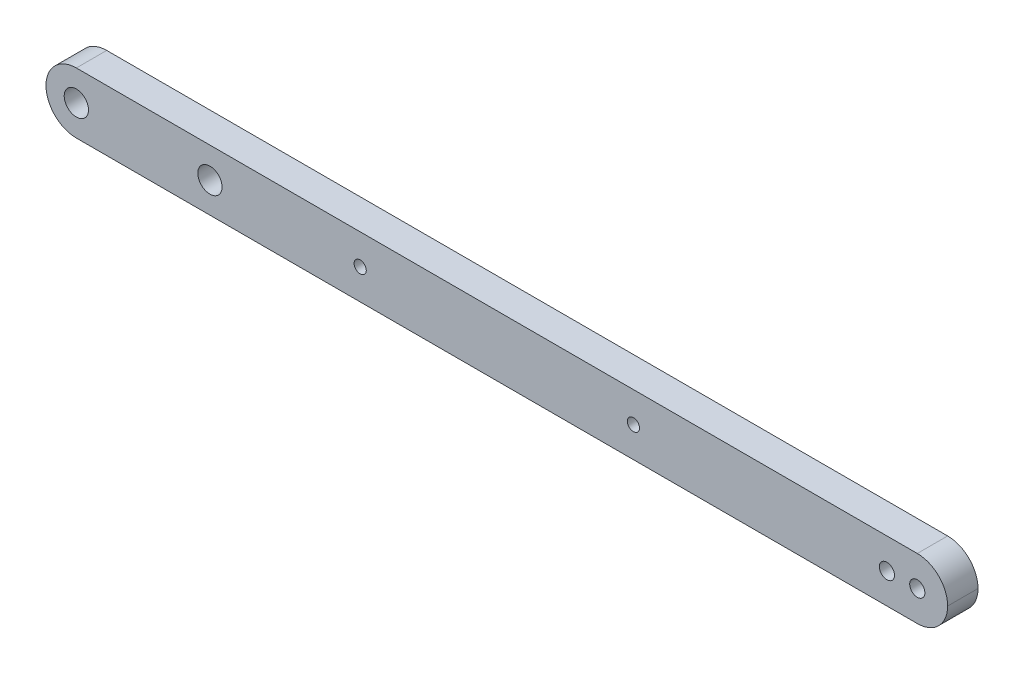
ISO-10303-21;
HEADER;
FILE_DESCRIPTION(('STEP AP214'),'2;1');
FILE_NAME('part.step','',(''),(''),'','','');
FILE_SCHEMA(('AUTOMOTIVE_DESIGN { 1 0 10303 214 1 1 1 1 }'));
ENDSEC;
DATA;
#1=APPLICATION_CONTEXT('core data for automotive mechanical design processes');
#2=APPLICATION_PROTOCOL_DEFINITION('international standard','automotive_design',2000,#1);
#3=PRODUCT_CONTEXT('',#1,'mechanical');
#4=PRODUCT('Part','Part','',(#3));
#5=PRODUCT_RELATED_PRODUCT_CATEGORY('part','',(#4));
#6=PRODUCT_DEFINITION_FORMATION('','',#4);
#7=PRODUCT_DEFINITION_CONTEXT('part definition',#1,'design');
#8=PRODUCT_DEFINITION('design','',#6,#7);
#9=PRODUCT_DEFINITION_SHAPE('','',#8);
#10=(LENGTH_UNIT() NAMED_UNIT(*) SI_UNIT(.MILLI.,.METRE.));
#11=(NAMED_UNIT(*) PLANE_ANGLE_UNIT() SI_UNIT($,.RADIAN.));
#12=(NAMED_UNIT(*) SI_UNIT($,.STERADIAN.) SOLID_ANGLE_UNIT());
#13=UNCERTAINTY_MEASURE_WITH_UNIT(LENGTH_MEASURE(1.E-05),#10,'distance_accuracy_value','');
#14=(GEOMETRIC_REPRESENTATION_CONTEXT(3) GLOBAL_UNCERTAINTY_ASSIGNED_CONTEXT((#13)) GLOBAL_UNIT_ASSIGNED_CONTEXT((#10,
#11,#12)) REPRESENTATION_CONTEXT('',''));
#15=CARTESIAN_POINT('',(0.,0.,0.));
#16=DIRECTION('',(0.,0.,1.));
#17=DIRECTION('',(1.,0.,0.));
#18=AXIS2_PLACEMENT_3D('',#15,#16,#17);
#19=CARTESIAN_POINT('',(0.,0.,10.));
#20=DIRECTION('',(0.,0.,1.));
#21=DIRECTION('',(1.,0.,0.));
#22=AXIS2_PLACEMENT_3D('',#19,#20,#21);
#23=PLANE('',#22);
#24=CARTESIAN_POINT('',(103.5,10.,10.));
#25=DIRECTION('',(0.,0.,1.));
#26=DIRECTION('',(1.,0.,0.));
#27=AXIS2_PLACEMENT_3D('',#24,#25,#26);
#28=CIRCLE('',#27,2.);
#29=CARTESIAN_POINT('',(105.5,10.,10.));
#30=VERTEX_POINT('',#29);
#31=EDGE_CURVE('E177',#30,#30,#28,.T.);
#32=ORIENTED_EDGE('',*,*,#31,.F.);
#33=EDGE_LOOP('',(#32));
#34=FACE_BOUND('',#33,.T.);
#35=CARTESIAN_POINT('',(277.,10.,10.));
#36=DIRECTION('',(0.,0.,1.));
#37=DIRECTION('',(1.,0.,0.));
#38=AXIS2_PLACEMENT_3D('',#35,#36,#37);
#39=CIRCLE('',#38,2.50000000000002);
#40=CARTESIAN_POINT('',(279.5,10.,10.));
#41=VERTEX_POINT('',#40);
#42=EDGE_CURVE('E165',#41,#41,#39,.T.);
#43=ORIENTED_EDGE('',*,*,#42,.F.);
#44=EDGE_LOOP('',(#43));
#45=FACE_BOUND('',#44,.T.);
#46=CARTESIAN_POINT('',(54.,10.,10.));
#47=DIRECTION('',(0.,0.,1.));
#48=DIRECTION('',(1.,0.,0.));
#49=AXIS2_PLACEMENT_3D('',#46,#47,#48);
#50=CIRCLE('',#49,4.00000000000001);
#51=CARTESIAN_POINT('',(58.,10.,10.));
#52=VERTEX_POINT('',#51);
#53=EDGE_CURVE('E120',#52,#52,#50,.T.);
#54=ORIENTED_EDGE('',*,*,#53,.F.);
#55=EDGE_LOOP('',(#54));
#56=FACE_BOUND('',#55,.T.);
#57=CARTESIAN_POINT('',(10.,10.,10.));
#58=DIRECTION('',(0.,0.,1.));
#59=DIRECTION('',(1.,0.,0.));
#60=AXIS2_PLACEMENT_3D('',#57,#58,#59);
#61=CIRCLE('',#60,10.);
#62=CARTESIAN_POINT('',(10.,20.,10.));
#63=VERTEX_POINT('',#62);
#64=CARTESIAN_POINT('',(0.,10.,10.));
#65=VERTEX_POINT('',#64);
#66=EDGE_CURVE('E137',#63,#65,#61,.T.);
#67=ORIENTED_EDGE('',*,*,#66,.T.);
#68=CARTESIAN_POINT('',(10.,10.,10.));
#69=DIRECTION('',(0.,0.,1.));
#70=DIRECTION('',(1.,0.,0.));
#71=AXIS2_PLACEMENT_3D('',#68,#69,#70);
#72=CIRCLE('',#71,10.);
#73=CARTESIAN_POINT('',(10.,0.,10.));
#74=VERTEX_POINT('',#73);
#75=EDGE_CURVE('E139',#65,#74,#72,.T.);
#76=ORIENTED_EDGE('',*,*,#75,.T.);
#77=DIRECTION('',(1.,0.,0.));
#78=VECTOR('',#77,1.);
#79=CARTESIAN_POINT('',(0.,0.,10.));
#80=LINE('',#79,#78);
#81=CARTESIAN_POINT('',(287.,0.,10.));
#82=VERTEX_POINT('',#81);
#83=EDGE_CURVE('E111',#74,#82,#80,.T.);
#84=ORIENTED_EDGE('',*,*,#83,.T.);
#85=CARTESIAN_POINT('',(287.,10.,10.));
#86=DIRECTION('',(0.,0.,1.));
#87=DIRECTION('',(1.,0.,0.));
#88=AXIS2_PLACEMENT_3D('',#85,#86,#87);
#89=CIRCLE('',#88,10.);
#90=CARTESIAN_POINT('',(297.,10.,10.));
#91=VERTEX_POINT('',#90);
#92=EDGE_CURVE('E135',#82,#91,#89,.T.);
#93=ORIENTED_EDGE('',*,*,#92,.T.);
#94=CARTESIAN_POINT('',(287.,10.,10.));
#95=DIRECTION('',(0.,0.,1.));
#96=DIRECTION('',(1.,0.,0.));
#97=AXIS2_PLACEMENT_3D('',#94,#95,#96);
#98=CIRCLE('',#97,10.);
#99=CARTESIAN_POINT('',(287.,20.,10.));
#100=VERTEX_POINT('',#99);
#101=EDGE_CURVE('E59',#91,#100,#98,.T.);
#102=ORIENTED_EDGE('',*,*,#101,.T.);
#103=DIRECTION('',(-1.,0.,0.));
#104=VECTOR('',#103,1.);
#105=CARTESIAN_POINT('',(0.,20.,10.));
#106=LINE('',#105,#104);
#107=EDGE_CURVE('E127',#100,#63,#106,.T.);
#108=ORIENTED_EDGE('',*,*,#107,.T.);
#109=EDGE_LOOP('',(#67,#76,#84,#93,#102,#108));
#110=FACE_BOUND('',#109,.T.);
#111=CARTESIAN_POINT('',(10.,10.,10.));
#112=DIRECTION('',(0.,0.,1.));
#113=DIRECTION('',(1.,0.,0.));
#114=AXIS2_PLACEMENT_3D('',#111,#112,#113);
#115=CIRCLE('',#114,4.);
#116=CARTESIAN_POINT('',(14.,10.,10.));
#117=VERTEX_POINT('',#116);
#118=EDGE_CURVE('E160',#117,#117,#115,.T.);
#119=ORIENTED_EDGE('',*,*,#118,.F.);
#120=EDGE_LOOP('',(#119));
#121=FACE_BOUND('',#120,.T.);
#122=CARTESIAN_POINT('',(287.,10.,10.));
#123=DIRECTION('',(0.,0.,1.));
#124=DIRECTION('',(1.,0.,0.));
#125=AXIS2_PLACEMENT_3D('',#122,#123,#124);
#126=CIRCLE('',#125,2.50000000000002);
#127=CARTESIAN_POINT('',(289.5,10.,10.));
#128=VERTEX_POINT('',#127);
#129=EDGE_CURVE('E171',#128,#128,#126,.T.);
#130=ORIENTED_EDGE('',*,*,#129,.F.);
#131=EDGE_LOOP('',(#130));
#132=FACE_BOUND('',#131,.T.);
#133=CARTESIAN_POINT('',(193.5,10.,10.));
#134=DIRECTION('',(0.,0.,1.));
#135=DIRECTION('',(1.,0.,0.));
#136=AXIS2_PLACEMENT_3D('',#133,#134,#135);
#137=CIRCLE('',#136,2.);
#138=CARTESIAN_POINT('',(195.5,10.,10.));
#139=VERTEX_POINT('',#138);
#140=EDGE_CURVE('E143',#139,#139,#137,.T.);
#141=ORIENTED_EDGE('',*,*,#140,.F.);
#142=EDGE_LOOP('',(#141));
#143=FACE_BOUND('',#142,.T.);
#144=ADVANCED_FACE('F37',(#34,#45,#56,#110,#121,#132,#143),#23,.T.);
#145=CARTESIAN_POINT('',(0.,0.,0.));
#146=DIRECTION('',(0.,0.,1.));
#147=DIRECTION('',(1.,0.,0.));
#148=AXIS2_PLACEMENT_3D('',#145,#146,#147);
#149=PLANE('',#148);
#150=DIRECTION('',(1.,0.,0.));
#151=VECTOR('',#150,1.);
#152=CARTESIAN_POINT('',(0.,0.,0.));
#153=LINE('',#152,#151);
#154=CARTESIAN_POINT('',(10.,0.,0.));
#155=VERTEX_POINT('',#154);
#156=CARTESIAN_POINT('',(287.,0.,0.));
#157=VERTEX_POINT('',#156);
#158=EDGE_CURVE('E108',#155,#157,#153,.T.);
#159=ORIENTED_EDGE('',*,*,#158,.F.);
#160=CARTESIAN_POINT('',(10.,10.,0.));
#161=DIRECTION('',(0.,0.,1.));
#162=DIRECTION('',(1.,0.,0.));
#163=AXIS2_PLACEMENT_3D('',#160,#161,#162);
#164=CIRCLE('',#163,10.);
#165=CARTESIAN_POINT('',(0.,10.,0.));
#166=VERTEX_POINT('',#165);
#167=EDGE_CURVE('E91',#155,#166,#164,.F.);
#168=ORIENTED_EDGE('',*,*,#167,.T.);
#169=CARTESIAN_POINT('',(10.,10.,0.));
#170=DIRECTION('',(0.,0.,1.));
#171=DIRECTION('',(1.,0.,0.));
#172=AXIS2_PLACEMENT_3D('',#169,#170,#171);
#173=CIRCLE('',#172,10.);
#174=CARTESIAN_POINT('',(10.,20.,0.));
#175=VERTEX_POINT('',#174);
#176=EDGE_CURVE('E101',#166,#175,#173,.F.);
#177=ORIENTED_EDGE('',*,*,#176,.T.);
#178=DIRECTION('',(-1.,0.,0.));
#179=VECTOR('',#178,1.);
#180=CARTESIAN_POINT('',(0.,20.,0.));
#181=LINE('',#180,#179);
#182=CARTESIAN_POINT('',(287.,20.,0.));
#183=VERTEX_POINT('',#182);
#184=EDGE_CURVE('E119',#183,#175,#181,.T.);
#185=ORIENTED_EDGE('',*,*,#184,.F.);
#186=CARTESIAN_POINT('',(287.,10.,0.));
#187=DIRECTION('',(0.,0.,1.));
#188=DIRECTION('',(1.,0.,0.));
#189=AXIS2_PLACEMENT_3D('',#186,#187,#188);
#190=CIRCLE('',#189,10.);
#191=CARTESIAN_POINT('',(297.,10.,0.));
#192=VERTEX_POINT('',#191);
#193=EDGE_CURVE('E112',#183,#192,#190,.F.);
#194=ORIENTED_EDGE('',*,*,#193,.T.);
#195=CARTESIAN_POINT('',(287.,10.,0.));
#196=DIRECTION('',(0.,0.,1.));
#197=DIRECTION('',(1.,0.,0.));
#198=AXIS2_PLACEMENT_3D('',#195,#196,#197);
#199=CIRCLE('',#198,10.);
#200=EDGE_CURVE('E118',#192,#157,#199,.F.);
#201=ORIENTED_EDGE('',*,*,#200,.T.);
#202=EDGE_LOOP('',(#159,#168,#177,#185,#194,#201));
#203=FACE_BOUND('',#202,.T.);
#204=CARTESIAN_POINT('',(54.,10.,0.));
#205=DIRECTION('',(0.,0.,1.));
#206=DIRECTION('',(1.,0.,0.));
#207=AXIS2_PLACEMENT_3D('',#204,#205,#206);
#208=CIRCLE('',#207,4.00000000000001);
#209=CARTESIAN_POINT('',(58.,10.,0.));
#210=VERTEX_POINT('',#209);
#211=EDGE_CURVE('E124',#210,#210,#208,.T.);
#212=ORIENTED_EDGE('',*,*,#211,.T.);
#213=EDGE_LOOP('',(#212));
#214=FACE_BOUND('',#213,.T.);
#215=CARTESIAN_POINT('',(10.,10.,0.));
#216=DIRECTION('',(0.,0.,1.));
#217=DIRECTION('',(1.,0.,0.));
#218=AXIS2_PLACEMENT_3D('',#215,#216,#217);
#219=CIRCLE('',#218,4.);
#220=CARTESIAN_POINT('',(14.,10.,0.));
#221=VERTEX_POINT('',#220);
#222=EDGE_CURVE('E162',#221,#221,#219,.T.);
#223=ORIENTED_EDGE('',*,*,#222,.T.);
#224=EDGE_LOOP('',(#223));
#225=FACE_BOUND('',#224,.T.);
#226=CARTESIAN_POINT('',(277.,10.,0.));
#227=DIRECTION('',(0.,0.,1.));
#228=DIRECTION('',(1.,0.,0.));
#229=AXIS2_PLACEMENT_3D('',#226,#227,#228);
#230=CIRCLE('',#229,2.50000000000002);
#231=CARTESIAN_POINT('',(279.5,10.,0.));
#232=VERTEX_POINT('',#231);
#233=EDGE_CURVE('E168',#232,#232,#230,.T.);
#234=ORIENTED_EDGE('',*,*,#233,.T.);
#235=EDGE_LOOP('',(#234));
#236=FACE_BOUND('',#235,.T.);
#237=CARTESIAN_POINT('',(287.,10.,0.));
#238=DIRECTION('',(0.,0.,1.));
#239=DIRECTION('',(1.,0.,0.));
#240=AXIS2_PLACEMENT_3D('',#237,#238,#239);
#241=CIRCLE('',#240,2.50000000000002);
#242=CARTESIAN_POINT('',(289.5,10.,0.));
#243=VERTEX_POINT('',#242);
#244=EDGE_CURVE('E174',#243,#243,#241,.T.);
#245=ORIENTED_EDGE('',*,*,#244,.T.);
#246=EDGE_LOOP('',(#245));
#247=FACE_BOUND('',#246,.T.);
#248=CARTESIAN_POINT('',(103.5,10.,0.));
#249=DIRECTION('',(0.,0.,1.));
#250=DIRECTION('',(1.,0.,0.));
#251=AXIS2_PLACEMENT_3D('',#248,#249,#250);
#252=CIRCLE('',#251,2.);
#253=CARTESIAN_POINT('',(105.5,10.,0.));
#254=VERTEX_POINT('',#253);
#255=EDGE_CURVE('E180',#254,#254,#252,.T.);
#256=ORIENTED_EDGE('',*,*,#255,.T.);
#257=EDGE_LOOP('',(#256));
#258=FACE_BOUND('',#257,.T.);
#259=CARTESIAN_POINT('',(193.5,10.,0.));
#260=DIRECTION('',(0.,0.,1.));
#261=DIRECTION('',(1.,0.,0.));
#262=AXIS2_PLACEMENT_3D('',#259,#260,#261);
#263=CIRCLE('',#262,2.);
#264=CARTESIAN_POINT('',(195.5,10.,0.));
#265=VERTEX_POINT('',#264);
#266=EDGE_CURVE('E141',#265,#265,#263,.T.);
#267=ORIENTED_EDGE('',*,*,#266,.T.);
#268=EDGE_LOOP('',(#267));
#269=FACE_BOUND('',#268,.T.);
#270=ADVANCED_FACE('F115',(#203,#214,#225,#236,#247,#258,#269),#149,.F.);
#271=CARTESIAN_POINT('',(0.,0.,10.));
#272=DIRECTION('',(0.,1.,0.));
#273=DIRECTION('',(0.,0.,1.));
#274=AXIS2_PLACEMENT_3D('',#271,#272,#273);
#275=PLANE('',#274);
#276=ORIENTED_EDGE('',*,*,#83,.F.);
#277=DIRECTION('',(0.,0.,-1.));
#278=VECTOR('',#277,1.);
#279=CARTESIAN_POINT('',(10.,0.,10.));
#280=LINE('',#279,#278);
#281=EDGE_CURVE('E95',#74,#155,#280,.T.);
#282=ORIENTED_EDGE('',*,*,#281,.T.);
#283=ORIENTED_EDGE('',*,*,#158,.T.);
#284=DIRECTION('',(0.,0.,-1.));
#285=VECTOR('',#284,1.);
#286=CARTESIAN_POINT('',(287.,0.,10.));
#287=LINE('',#286,#285);
#288=EDGE_CURVE('E113',#157,#82,#287,.F.);
#289=ORIENTED_EDGE('',*,*,#288,.T.);
#290=EDGE_LOOP('',(#276,#282,#283,#289));
#291=FACE_BOUND('',#290,.T.);
#292=ADVANCED_FACE('F106',(#291),#275,.F.);
#293=CARTESIAN_POINT('',(0.,20.,10.));
#294=DIRECTION('',(0.,-1.,0.));
#295=DIRECTION('',(0.,0.,-1.));
#296=AXIS2_PLACEMENT_3D('',#293,#294,#295);
#297=PLANE('',#296);
#298=ORIENTED_EDGE('',*,*,#184,.T.);
#299=DIRECTION('',(0.,0.,-1.));
#300=VECTOR('',#299,1.);
#301=CARTESIAN_POINT('',(10.,20.,10.));
#302=LINE('',#301,#300);
#303=EDGE_CURVE('E11',#175,#63,#302,.F.);
#304=ORIENTED_EDGE('',*,*,#303,.T.);
#305=ORIENTED_EDGE('',*,*,#107,.F.);
#306=DIRECTION('',(0.,0.,-1.));
#307=VECTOR('',#306,1.);
#308=CARTESIAN_POINT('',(287.,20.,10.));
#309=LINE('',#308,#307);
#310=EDGE_CURVE('E46',#100,#183,#309,.T.);
#311=ORIENTED_EDGE('',*,*,#310,.T.);
#312=EDGE_LOOP('',(#298,#304,#305,#311));
#313=FACE_BOUND('',#312,.T.);
#314=ADVANCED_FACE('F153',(#313),#297,.F.);
#315=CARTESIAN_POINT('',(54.,10.,10.));
#316=DIRECTION('',(0.,0.,-1.));
#317=DIRECTION('',(-1.,0.,0.));
#318=AXIS2_PLACEMENT_3D('',#315,#316,#317);
#319=CYLINDRICAL_SURFACE('',#318,4.00000000000001);
#320=ORIENTED_EDGE('',*,*,#53,.T.);
#321=EDGE_LOOP('',(#320));
#322=FACE_BOUND('',#321,.T.);
#323=ORIENTED_EDGE('',*,*,#211,.F.);
#324=EDGE_LOOP('',(#323));
#325=FACE_BOUND('',#324,.T.);
#326=ADVANCED_FACE('F201',(#322,#325),#319,.F.);
#327=CARTESIAN_POINT('',(10.,10.,10.));
#328=DIRECTION('',(0.,0.,-1.));
#329=DIRECTION('',(-1.,0.,0.));
#330=AXIS2_PLACEMENT_3D('',#327,#328,#329);
#331=CYLINDRICAL_SURFACE('',#330,4.);
#332=ORIENTED_EDGE('',*,*,#118,.T.);
#333=EDGE_LOOP('',(#332));
#334=FACE_BOUND('',#333,.T.);
#335=ORIENTED_EDGE('',*,*,#222,.F.);
#336=EDGE_LOOP('',(#335));
#337=FACE_BOUND('',#336,.T.);
#338=ADVANCED_FACE('F255',(#334,#337),#331,.F.);
#339=CARTESIAN_POINT('',(277.,10.,10.));
#340=DIRECTION('',(0.,0.,-1.));
#341=DIRECTION('',(-1.,0.,0.));
#342=AXIS2_PLACEMENT_3D('',#339,#340,#341);
#343=CYLINDRICAL_SURFACE('',#342,2.50000000000002);
#344=ORIENTED_EDGE('',*,*,#42,.T.);
#345=EDGE_LOOP('',(#344));
#346=FACE_BOUND('',#345,.T.);
#347=ORIENTED_EDGE('',*,*,#233,.F.);
#348=EDGE_LOOP('',(#347));
#349=FACE_BOUND('',#348,.T.);
#350=ADVANCED_FACE('F247',(#346,#349),#343,.F.);
#351=CARTESIAN_POINT('',(287.,10.,10.));
#352=DIRECTION('',(0.,0.,-1.));
#353=DIRECTION('',(-1.,0.,0.));
#354=AXIS2_PLACEMENT_3D('',#351,#352,#353);
#355=CYLINDRICAL_SURFACE('',#354,2.50000000000002);
#356=ORIENTED_EDGE('',*,*,#129,.T.);
#357=EDGE_LOOP('',(#356));
#358=FACE_BOUND('',#357,.T.);
#359=ORIENTED_EDGE('',*,*,#244,.F.);
#360=EDGE_LOOP('',(#359));
#361=FACE_BOUND('',#360,.T.);
#362=ADVANCED_FACE('F239',(#358,#361),#355,.F.);
#363=CARTESIAN_POINT('',(103.5,10.,10.));
#364=DIRECTION('',(0.,0.,-1.));
#365=DIRECTION('',(-1.,0.,0.));
#366=AXIS2_PLACEMENT_3D('',#363,#364,#365);
#367=CYLINDRICAL_SURFACE('',#366,2.);
#368=ORIENTED_EDGE('',*,*,#31,.T.);
#369=EDGE_LOOP('',(#368));
#370=FACE_BOUND('',#369,.T.);
#371=ORIENTED_EDGE('',*,*,#255,.F.);
#372=EDGE_LOOP('',(#371));
#373=FACE_BOUND('',#372,.T.);
#374=ADVANCED_FACE('F232',(#370,#373),#367,.F.);
#375=CARTESIAN_POINT('',(193.5,10.,10.));
#376=DIRECTION('',(0.,0.,-1.));
#377=DIRECTION('',(-1.,0.,0.));
#378=AXIS2_PLACEMENT_3D('',#375,#376,#377);
#379=CYLINDRICAL_SURFACE('',#378,2.);
#380=ORIENTED_EDGE('',*,*,#140,.T.);
#381=EDGE_LOOP('',(#380));
#382=FACE_BOUND('',#381,.T.);
#383=ORIENTED_EDGE('',*,*,#266,.F.);
#384=EDGE_LOOP('',(#383));
#385=FACE_BOUND('',#384,.T.);
#386=ADVANCED_FACE('F188',(#382,#385),#379,.F.);
#387=CARTESIAN_POINT('',(10.,10.,10.));
#388=DIRECTION('',(0.,0.,-1.));
#389=DIRECTION('',(-1.,0.,0.));
#390=AXIS2_PLACEMENT_3D('',#387,#388,#389);
#391=CYLINDRICAL_SURFACE('',#390,10.);
#392=DIRECTION('',(0.,0.,-1.));
#393=VECTOR('',#392,1.);
#394=CARTESIAN_POINT('',(0.,10.,10.));
#395=LINE('',#394,#393);
#396=EDGE_CURVE('E97',#65,#166,#395,.T.);
#397=ORIENTED_EDGE('',*,*,#396,.F.);
#398=ORIENTED_EDGE('',*,*,#66,.F.);
#399=ORIENTED_EDGE('',*,*,#303,.F.);
#400=ORIENTED_EDGE('',*,*,#176,.F.);
#401=EDGE_LOOP('',(#397,#398,#399,#400));
#402=FACE_BOUND('',#401,.T.);
#403=ADVANCED_FACE('F155',(#402),#391,.T.);
#404=CARTESIAN_POINT('',(10.,10.,10.));
#405=DIRECTION('',(0.,0.,-1.));
#406=DIRECTION('',(-1.,0.,0.));
#407=AXIS2_PLACEMENT_3D('',#404,#405,#406);
#408=CYLINDRICAL_SURFACE('',#407,10.);
#409=ORIENTED_EDGE('',*,*,#75,.F.);
#410=ORIENTED_EDGE('',*,*,#396,.T.);
#411=ORIENTED_EDGE('',*,*,#167,.F.);
#412=ORIENTED_EDGE('',*,*,#281,.F.);
#413=EDGE_LOOP('',(#409,#410,#411,#412));
#414=FACE_BOUND('',#413,.T.);
#415=ADVANCED_FACE('F94',(#414),#408,.T.);
#416=CARTESIAN_POINT('',(287.,10.,10.));
#417=DIRECTION('',(0.,0.,-1.));
#418=DIRECTION('',(-1.,0.,0.));
#419=AXIS2_PLACEMENT_3D('',#416,#417,#418);
#420=CYLINDRICAL_SURFACE('',#419,10.);
#421=ORIENTED_EDGE('',*,*,#310,.F.);
#422=ORIENTED_EDGE('',*,*,#101,.F.);
#423=DIRECTION('',(0.,0.,-1.));
#424=VECTOR('',#423,1.);
#425=CARTESIAN_POINT('',(297.,10.,10.));
#426=LINE('',#425,#424);
#427=EDGE_CURVE('E41',#192,#91,#426,.F.);
#428=ORIENTED_EDGE('',*,*,#427,.F.);
#429=ORIENTED_EDGE('',*,*,#193,.F.);
#430=EDGE_LOOP('',(#421,#422,#428,#429));
#431=FACE_BOUND('',#430,.T.);
#432=ADVANCED_FACE('F39',(#431),#420,.T.);
#433=CARTESIAN_POINT('',(287.,10.,10.));
#434=DIRECTION('',(0.,0.,-1.));
#435=DIRECTION('',(-1.,0.,0.));
#436=AXIS2_PLACEMENT_3D('',#433,#434,#435);
#437=CYLINDRICAL_SURFACE('',#436,10.);
#438=ORIENTED_EDGE('',*,*,#92,.F.);
#439=ORIENTED_EDGE('',*,*,#288,.F.);
#440=ORIENTED_EDGE('',*,*,#200,.F.);
#441=ORIENTED_EDGE('',*,*,#427,.T.);
#442=EDGE_LOOP('',(#438,#439,#440,#441));
#443=FACE_BOUND('',#442,.T.);
#444=ADVANCED_FACE('F148',(#443),#437,.T.);
#445=CLOSED_SHELL('',(#144,#270,#292,#314,#326,#338,#350,#362,#374,#386,#403,#415,#432,#444));
#446=MANIFOLD_SOLID_BREP('B2',#445);
#447=ADVANCED_BREP_SHAPE_REPRESENTATION('',(#18,#446),#14);
#448=SHAPE_DEFINITION_REPRESENTATION(#9,#447);
ENDSEC;
END-ISO-10303-21;
